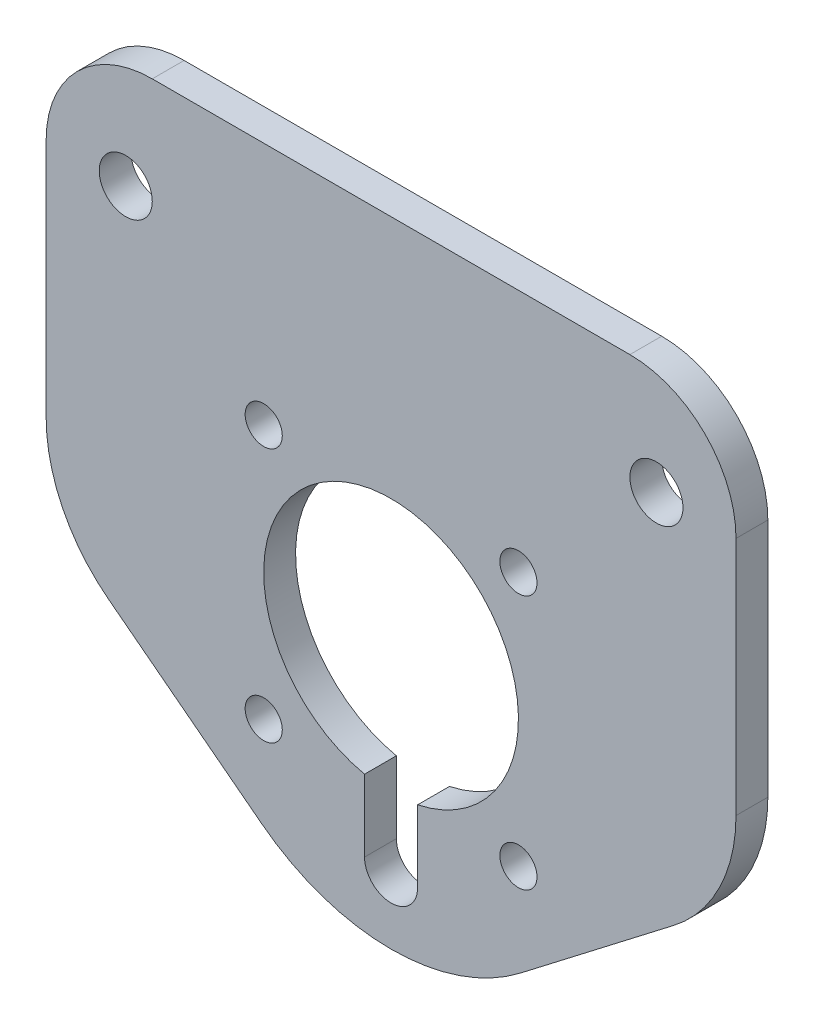
ISO-10303-21;
HEADER;
FILE_DESCRIPTION(('STEP AP214'),'2;1');
FILE_NAME('part.step','',(''),(''),'','','');
FILE_SCHEMA(('AUTOMOTIVE_DESIGN { 1 0 10303 214 1 1 1 1 }'));
ENDSEC;
DATA;
#1=APPLICATION_CONTEXT('core data for automotive mechanical design processes');
#2=APPLICATION_PROTOCOL_DEFINITION('international standard','automotive_design',2000,#1);
#3=PRODUCT_CONTEXT('',#1,'mechanical');
#4=PRODUCT('Part','Part','',(#3));
#5=PRODUCT_RELATED_PRODUCT_CATEGORY('part','',(#4));
#6=PRODUCT_DEFINITION_FORMATION('','',#4);
#7=PRODUCT_DEFINITION_CONTEXT('part definition',#1,'design');
#8=PRODUCT_DEFINITION('design','',#6,#7);
#9=PRODUCT_DEFINITION_SHAPE('','',#8);
#10=(LENGTH_UNIT() NAMED_UNIT(*) SI_UNIT(.MILLI.,.METRE.));
#11=(NAMED_UNIT(*) PLANE_ANGLE_UNIT() SI_UNIT($,.RADIAN.));
#12=(NAMED_UNIT(*) SI_UNIT($,.STERADIAN.) SOLID_ANGLE_UNIT());
#13=UNCERTAINTY_MEASURE_WITH_UNIT(LENGTH_MEASURE(1.E-05),#10,'distance_accuracy_value','');
#14=(GEOMETRIC_REPRESENTATION_CONTEXT(3) GLOBAL_UNCERTAINTY_ASSIGNED_CONTEXT((#13)) GLOBAL_UNIT_ASSIGNED_CONTEXT((#10,
#11,#12)) REPRESENTATION_CONTEXT('',''));
#15=CARTESIAN_POINT('',(0.,0.,0.));
#16=DIRECTION('',(0.,0.,1.));
#17=DIRECTION('',(1.,0.,0.));
#18=AXIS2_PLACEMENT_3D('',#15,#16,#17);
#19=CARTESIAN_POINT('',(0.,0.,3.));
#20=DIRECTION('',(0.,0.,1.));
#21=DIRECTION('',(1.,0.,0.));
#22=AXIS2_PLACEMENT_3D('',#19,#20,#21);
#23=PLANE('',#22);
#24=CARTESIAN_POINT('',(12.,-17.,3.));
#25=DIRECTION('',(0.,0.,1.));
#26=DIRECTION('',(1.,0.,0.));
#27=AXIS2_PLACEMENT_3D('',#24,#25,#26);
#28=CIRCLE('',#27,1.75);
#29=CARTESIAN_POINT('',(13.75,-17.,3.));
#30=VERTEX_POINT('',#29);
#31=EDGE_CURVE('E520',#30,#30,#28,.T.);
#32=ORIENTED_EDGE('',*,*,#31,.F.);
#33=EDGE_LOOP('',(#32));
#34=FACE_BOUND('',#33,.T.);
#35=CARTESIAN_POINT('',(-12.,-17.,3.));
#36=DIRECTION('',(0.,0.,1.));
#37=DIRECTION('',(1.,0.,0.));
#38=AXIS2_PLACEMENT_3D('',#35,#36,#37);
#39=CIRCLE('',#38,1.75);
#40=CARTESIAN_POINT('',(-10.25,-17.,3.));
#41=VERTEX_POINT('',#40);
#42=EDGE_CURVE('E514',#41,#41,#39,.T.);
#43=ORIENTED_EDGE('',*,*,#42,.F.);
#44=EDGE_LOOP('',(#43));
#45=FACE_BOUND('',#44,.T.);
#46=CARTESIAN_POINT('',(0.,-5.,3.));
#47=DIRECTION('',(0.,0.,1.));
#48=DIRECTION('',(1.,0.,0.));
#49=AXIS2_PLACEMENT_3D('',#46,#47,#48);
#50=CIRCLE('',#49,12.);
#51=CARTESIAN_POINT('',(2.49999999999302,-16.736694594307,3.));
#52=VERTEX_POINT('',#51);
#53=CARTESIAN_POINT('',(-2.50000000000698,-16.736694594304,3.));
#54=VERTEX_POINT('',#53);
#55=EDGE_CURVE('E134',#52,#54,#50,.T.);
#56=ORIENTED_EDGE('',*,*,#55,.F.);
#57=DIRECTION('',(0.,1.,0.));
#58=VECTOR('',#57,1.);
#59=CARTESIAN_POINT('',(2.49999999999302,-16.5,3.));
#60=LINE('',#59,#58);
#61=CARTESIAN_POINT('',(2.49999999999302,-23.5,3.));
#62=VERTEX_POINT('',#61);
#63=EDGE_CURVE('E158',#62,#52,#60,.T.);
#64=ORIENTED_EDGE('',*,*,#63,.F.);
#65=CARTESIAN_POINT('',(-6.98116176369495E-12,-23.5,3.));
#66=DIRECTION('',(0.,0.,1.));
#67=DIRECTION('',(1.,0.,0.));
#68=AXIS2_PLACEMENT_3D('',#65,#66,#67);
#69=CIRCLE('',#68,2.5);
#70=CARTESIAN_POINT('',(-2.50000000000698,-23.5,3.));
#71=VERTEX_POINT('',#70);
#72=EDGE_CURVE('E155',#71,#62,#69,.T.);
#73=ORIENTED_EDGE('',*,*,#72,.F.);
#74=DIRECTION('',(0.,-1.,0.));
#75=VECTOR('',#74,1.);
#76=CARTESIAN_POINT('',(-2.50000000000698,-16.5,3.));
#77=LINE('',#76,#75);
#78=EDGE_CURVE('E147',#54,#71,#77,.T.);
#79=ORIENTED_EDGE('',*,*,#78,.F.);
#80=EDGE_LOOP('',(#56,#64,#73,#79));
#81=FACE_BOUND('',#80,.T.);
#82=CARTESIAN_POINT('',(-12.,7.,3.));
#83=DIRECTION('',(0.,0.,1.));
#84=DIRECTION('',(1.,0.,0.));
#85=AXIS2_PLACEMENT_3D('',#82,#83,#84);
#86=CIRCLE('',#85,1.75);
#87=CARTESIAN_POINT('',(-10.25,7.,3.));
#88=VERTEX_POINT('',#87);
#89=EDGE_CURVE('E507',#88,#88,#86,.T.);
#90=ORIENTED_EDGE('',*,*,#89,.F.);
#91=EDGE_LOOP('',(#90));
#92=FACE_BOUND('',#91,.T.);
#93=CARTESIAN_POINT('',(12.,7.,3.));
#94=DIRECTION('',(0.,0.,1.));
#95=DIRECTION('',(1.,0.,0.));
#96=AXIS2_PLACEMENT_3D('',#93,#94,#95);
#97=CIRCLE('',#96,1.75);
#98=CARTESIAN_POINT('',(13.75,7.,3.));
#99=VERTEX_POINT('',#98);
#100=EDGE_CURVE('E519',#99,#99,#97,.T.);
#101=ORIENTED_EDGE('',*,*,#100,.F.);
#102=EDGE_LOOP('',(#101));
#103=FACE_BOUND('',#102,.T.);
#104=CARTESIAN_POINT('',(25.,20.,3.));
#105=DIRECTION('',(0.,0.,1.));
#106=DIRECTION('',(1.,0.,0.));
#107=AXIS2_PLACEMENT_3D('',#104,#105,#106);
#108=CIRCLE('',#107,2.5);
#109=CARTESIAN_POINT('',(27.5,20.,3.));
#110=VERTEX_POINT('',#109);
#111=EDGE_CURVE('E180',#110,#110,#108,.T.);
#112=ORIENTED_EDGE('',*,*,#111,.F.);
#113=EDGE_LOOP('',(#112));
#114=FACE_BOUND('',#113,.T.);
#115=DIRECTION('',(0.792623989104599,-0.609710760849693,0.));
#116=VECTOR('',#115,1.);
#117=CARTESIAN_POINT('',(0.,-35.,3.));
#118=LINE('',#117,#116);
#119=CARTESIAN_POINT('',(-26.6456614127454,-14.5033373748112,3.));
#120=VERTEX_POINT('',#119);
#121=CARTESIAN_POINT('',(-12.1942152169939,-25.6198344484662,3.));
#122=VERTEX_POINT('',#121);
#123=EDGE_CURVE('E195',#120,#122,#118,.T.);
#124=ORIENTED_EDGE('',*,*,#123,.T.);
#125=CARTESIAN_POINT('',(0.,-9.76735466637425,3.));
#126=DIRECTION('',(0.,0.,1.));
#127=DIRECTION('',(1.,0.,0.));
#128=AXIS2_PLACEMENT_3D('',#125,#126,#127);
#129=CIRCLE('',#128,20.);
#130=CARTESIAN_POINT('',(12.1942152169939,-25.6198344484662,3.));
#131=VERTEX_POINT('',#130);
#132=EDGE_CURVE('E241',#122,#131,#129,.T.);
#133=ORIENTED_EDGE('',*,*,#132,.T.);
#134=DIRECTION('',(0.792623989104599,0.609710760849693,0.));
#135=VECTOR('',#134,1.);
#136=CARTESIAN_POINT('',(32.5,-9.99999999999994,3.));
#137=LINE('',#136,#135);
#138=CARTESIAN_POINT('',(26.6456614127454,-14.5033373748112,3.));
#139=VERTEX_POINT('',#138);
#140=EDGE_CURVE('E198',#131,#139,#137,.T.);
#141=ORIENTED_EDGE('',*,*,#140,.T.);
#142=CARTESIAN_POINT('',(17.5,-2.61397753824219,3.));
#143=DIRECTION('',(0.,0.,1.));
#144=DIRECTION('',(1.,0.,0.));
#145=AXIS2_PLACEMENT_3D('',#142,#143,#144);
#146=CIRCLE('',#145,15.);
#147=CARTESIAN_POINT('',(32.5,-2.61397753824219,3.));
#148=VERTEX_POINT('',#147);
#149=EDGE_CURVE('E239',#139,#148,#146,.T.);
#150=ORIENTED_EDGE('',*,*,#149,.T.);
#151=DIRECTION('',(0.,1.,0.));
#152=VECTOR('',#151,1.);
#153=CARTESIAN_POINT('',(32.5,30.,3.));
#154=LINE('',#153,#152);
#155=CARTESIAN_POINT('',(32.5,20.,3.));
#156=VERTEX_POINT('',#155);
#157=EDGE_CURVE('E186',#148,#156,#154,.T.);
#158=ORIENTED_EDGE('',*,*,#157,.T.);
#159=CARTESIAN_POINT('',(22.5,20.,3.));
#160=DIRECTION('',(0.,0.,1.));
#161=DIRECTION('',(1.,0.,0.));
#162=AXIS2_PLACEMENT_3D('',#159,#160,#161);
#163=CIRCLE('',#162,10.);
#164=CARTESIAN_POINT('',(22.5,30.,3.));
#165=VERTEX_POINT('',#164);
#166=EDGE_CURVE('E233',#156,#165,#163,.T.);
#167=ORIENTED_EDGE('',*,*,#166,.T.);
#168=DIRECTION('',(-1.,0.,0.));
#169=VECTOR('',#168,1.);
#170=CARTESIAN_POINT('',(-32.5,30.,3.));
#171=LINE('',#170,#169);
#172=CARTESIAN_POINT('',(-22.5,30.,3.));
#173=VERTEX_POINT('',#172);
#174=EDGE_CURVE('E189',#165,#173,#171,.T.);
#175=ORIENTED_EDGE('',*,*,#174,.T.);
#176=CARTESIAN_POINT('',(-22.5,20.,3.));
#177=DIRECTION('',(0.,0.,1.));
#178=DIRECTION('',(1.,0.,0.));
#179=AXIS2_PLACEMENT_3D('',#176,#177,#178);
#180=CIRCLE('',#179,10.);
#181=CARTESIAN_POINT('',(-32.5,20.,3.));
#182=VERTEX_POINT('',#181);
#183=EDGE_CURVE('E235',#173,#182,#180,.T.);
#184=ORIENTED_EDGE('',*,*,#183,.T.);
#185=DIRECTION('',(0.,-1.,0.));
#186=VECTOR('',#185,1.);
#187=CARTESIAN_POINT('',(-32.5,-9.99999999999994,3.));
#188=LINE('',#187,#186);
#189=CARTESIAN_POINT('',(-32.5,-2.61397753824219,3.));
#190=VERTEX_POINT('',#189);
#191=EDGE_CURVE('E193',#182,#190,#188,.T.);
#192=ORIENTED_EDGE('',*,*,#191,.T.);
#193=CARTESIAN_POINT('',(-17.5,-2.61397753824219,3.));
#194=DIRECTION('',(0.,0.,1.));
#195=DIRECTION('',(1.,0.,0.));
#196=AXIS2_PLACEMENT_3D('',#193,#194,#195);
#197=CIRCLE('',#196,15.);
#198=EDGE_CURVE('E237',#190,#120,#197,.T.);
#199=ORIENTED_EDGE('',*,*,#198,.T.);
#200=EDGE_LOOP('',(#124,#133,#141,#150,#158,#167,#175,#184,#192,#199));
#201=FACE_BOUND('',#200,.T.);
#202=CARTESIAN_POINT('',(-25.,20.,3.));
#203=DIRECTION('',(0.,0.,1.));
#204=DIRECTION('',(1.,0.,0.));
#205=AXIS2_PLACEMENT_3D('',#202,#203,#204);
#206=CIRCLE('',#205,2.5);
#207=CARTESIAN_POINT('',(-22.5,20.,3.));
#208=VERTEX_POINT('',#207);
#209=EDGE_CURVE('E174',#208,#208,#206,.T.);
#210=ORIENTED_EDGE('',*,*,#209,.F.);
#211=EDGE_LOOP('',(#210));
#212=FACE_BOUND('',#211,.T.);
#213=ADVANCED_FACE('F34',(#34,#45,#81,#92,#103,#114,#201,#212),#23,.T.);
#214=CARTESIAN_POINT('',(0.,0.,0.));
#215=DIRECTION('',(0.,0.,1.));
#216=DIRECTION('',(1.,0.,0.));
#217=AXIS2_PLACEMENT_3D('',#214,#215,#216);
#218=PLANE('',#217);
#219=CARTESIAN_POINT('',(12.,-17.,0.));
#220=DIRECTION('',(0.,0.,1.));
#221=DIRECTION('',(1.,0.,0.));
#222=AXIS2_PLACEMENT_3D('',#219,#220,#221);
#223=CIRCLE('',#222,1.75);
#224=CARTESIAN_POINT('',(13.75,-17.,0.));
#225=VERTEX_POINT('',#224);
#226=EDGE_CURVE('E516',#225,#225,#223,.T.);
#227=ORIENTED_EDGE('',*,*,#226,.T.);
#228=EDGE_LOOP('',(#227));
#229=FACE_BOUND('',#228,.T.);
#230=CARTESIAN_POINT('',(-12.,-17.,0.));
#231=DIRECTION('',(0.,0.,1.));
#232=DIRECTION('',(1.,0.,0.));
#233=AXIS2_PLACEMENT_3D('',#230,#231,#232);
#234=CIRCLE('',#233,1.75);
#235=CARTESIAN_POINT('',(-10.25,-17.,0.));
#236=VERTEX_POINT('',#235);
#237=EDGE_CURVE('E523',#236,#236,#234,.T.);
#238=ORIENTED_EDGE('',*,*,#237,.T.);
#239=EDGE_LOOP('',(#238));
#240=FACE_BOUND('',#239,.T.);
#241=CARTESIAN_POINT('',(-12.,7.,0.));
#242=DIRECTION('',(0.,0.,1.));
#243=DIRECTION('',(1.,0.,0.));
#244=AXIS2_PLACEMENT_3D('',#241,#242,#243);
#245=CIRCLE('',#244,1.75);
#246=CARTESIAN_POINT('',(-10.25,7.,0.));
#247=VERTEX_POINT('',#246);
#248=EDGE_CURVE('E510',#247,#247,#245,.T.);
#249=ORIENTED_EDGE('',*,*,#248,.T.);
#250=EDGE_LOOP('',(#249));
#251=FACE_BOUND('',#250,.T.);
#252=CARTESIAN_POINT('',(12.,7.,0.));
#253=DIRECTION('',(0.,0.,1.));
#254=DIRECTION('',(1.,0.,0.));
#255=AXIS2_PLACEMENT_3D('',#252,#253,#254);
#256=CIRCLE('',#255,1.75);
#257=CARTESIAN_POINT('',(13.75,7.,0.));
#258=VERTEX_POINT('',#257);
#259=EDGE_CURVE('E150',#258,#258,#256,.T.);
#260=ORIENTED_EDGE('',*,*,#259,.T.);
#261=EDGE_LOOP('',(#260));
#262=FACE_BOUND('',#261,.T.);
#263=CARTESIAN_POINT('',(-25.,20.,0.));
#264=DIRECTION('',(0.,0.,1.));
#265=DIRECTION('',(1.,0.,0.));
#266=AXIS2_PLACEMENT_3D('',#263,#264,#265);
#267=CIRCLE('',#266,2.5);
#268=CARTESIAN_POINT('',(-22.5,20.,0.));
#269=VERTEX_POINT('',#268);
#270=EDGE_CURVE('E173',#269,#269,#267,.T.);
#271=ORIENTED_EDGE('',*,*,#270,.T.);
#272=EDGE_LOOP('',(#271));
#273=FACE_BOUND('',#272,.T.);
#274=CARTESIAN_POINT('',(25.,20.,0.));
#275=DIRECTION('',(0.,0.,1.));
#276=DIRECTION('',(1.,0.,0.));
#277=AXIS2_PLACEMENT_3D('',#274,#275,#276);
#278=CIRCLE('',#277,2.5);
#279=CARTESIAN_POINT('',(27.5,20.,0.));
#280=VERTEX_POINT('',#279);
#281=EDGE_CURVE('E177',#280,#280,#278,.T.);
#282=ORIENTED_EDGE('',*,*,#281,.T.);
#283=EDGE_LOOP('',(#282));
#284=FACE_BOUND('',#283,.T.);
#285=DIRECTION('',(0.792623989104599,0.609710760849693,0.));
#286=VECTOR('',#285,1.);
#287=CARTESIAN_POINT('',(32.5,-9.99999999999994,0.));
#288=LINE('',#287,#286);
#289=CARTESIAN_POINT('',(12.1942152169939,-25.6198344484662,0.));
#290=VERTEX_POINT('',#289);
#291=CARTESIAN_POINT('',(26.6456614127454,-14.5033373748112,0.));
#292=VERTEX_POINT('',#291);
#293=EDGE_CURVE('E190',#290,#292,#288,.T.);
#294=ORIENTED_EDGE('',*,*,#293,.F.);
#295=CARTESIAN_POINT('',(0.,-9.76735466637425,0.));
#296=DIRECTION('',(0.,0.,1.));
#297=DIRECTION('',(1.,0.,0.));
#298=AXIS2_PLACEMENT_3D('',#295,#296,#297);
#299=CIRCLE('',#298,20.);
#300=CARTESIAN_POINT('',(-12.1942152169939,-25.6198344484662,0.));
#301=VERTEX_POINT('',#300);
#302=EDGE_CURVE('E226',#290,#301,#299,.F.);
#303=ORIENTED_EDGE('',*,*,#302,.T.);
#304=DIRECTION('',(0.792623989104599,-0.609710760849693,0.));
#305=VECTOR('',#304,1.);
#306=CARTESIAN_POINT('',(0.,-35.,0.));
#307=LINE('',#306,#305);
#308=CARTESIAN_POINT('',(-26.6456614127454,-14.5033373748112,0.));
#309=VERTEX_POINT('',#308);
#310=EDGE_CURVE('E209',#309,#301,#307,.T.);
#311=ORIENTED_EDGE('',*,*,#310,.F.);
#312=CARTESIAN_POINT('',(-17.5,-2.61397753824219,0.));
#313=DIRECTION('',(0.,0.,1.));
#314=DIRECTION('',(1.,0.,0.));
#315=AXIS2_PLACEMENT_3D('',#312,#313,#314);
#316=CIRCLE('',#315,15.);
#317=CARTESIAN_POINT('',(-32.5,-2.61397753824219,0.));
#318=VERTEX_POINT('',#317);
#319=EDGE_CURVE('E222',#309,#318,#316,.F.);
#320=ORIENTED_EDGE('',*,*,#319,.T.);
#321=DIRECTION('',(0.,-1.,0.));
#322=VECTOR('',#321,1.);
#323=CARTESIAN_POINT('',(-32.5,-9.99999999999994,0.));
#324=LINE('',#323,#322);
#325=CARTESIAN_POINT('',(-32.5,20.,0.));
#326=VERTEX_POINT('',#325);
#327=EDGE_CURVE('E207',#326,#318,#324,.T.);
#328=ORIENTED_EDGE('',*,*,#327,.F.);
#329=CARTESIAN_POINT('',(-22.5,20.,0.));
#330=DIRECTION('',(0.,0.,1.));
#331=DIRECTION('',(1.,0.,0.));
#332=AXIS2_PLACEMENT_3D('',#329,#330,#331);
#333=CIRCLE('',#332,10.);
#334=CARTESIAN_POINT('',(-22.5,30.,0.));
#335=VERTEX_POINT('',#334);
#336=EDGE_CURVE('E220',#326,#335,#333,.F.);
#337=ORIENTED_EDGE('',*,*,#336,.T.);
#338=DIRECTION('',(-1.,0.,0.));
#339=VECTOR('',#338,1.);
#340=CARTESIAN_POINT('',(-32.5,30.,0.));
#341=LINE('',#340,#339);
#342=CARTESIAN_POINT('',(22.5,30.,0.));
#343=VERTEX_POINT('',#342);
#344=EDGE_CURVE('E204',#343,#335,#341,.T.);
#345=ORIENTED_EDGE('',*,*,#344,.F.);
#346=CARTESIAN_POINT('',(22.5,20.,0.));
#347=DIRECTION('',(0.,0.,1.));
#348=DIRECTION('',(1.,0.,0.));
#349=AXIS2_PLACEMENT_3D('',#346,#347,#348);
#350=CIRCLE('',#349,10.);
#351=CARTESIAN_POINT('',(32.5,20.,0.));
#352=VERTEX_POINT('',#351);
#353=EDGE_CURVE('E218',#343,#352,#350,.F.);
#354=ORIENTED_EDGE('',*,*,#353,.T.);
#355=DIRECTION('',(0.,1.,0.));
#356=VECTOR('',#355,1.);
#357=CARTESIAN_POINT('',(32.5,30.,0.));
#358=LINE('',#357,#356);
#359=CARTESIAN_POINT('',(32.5,-2.61397753824219,0.));
#360=VERTEX_POINT('',#359);
#361=EDGE_CURVE('E183',#360,#352,#358,.T.);
#362=ORIENTED_EDGE('',*,*,#361,.F.);
#363=CARTESIAN_POINT('',(17.5,-2.61397753824219,0.));
#364=DIRECTION('',(0.,0.,1.));
#365=DIRECTION('',(1.,0.,0.));
#366=AXIS2_PLACEMENT_3D('',#363,#364,#365);
#367=CIRCLE('',#366,15.);
#368=EDGE_CURVE('E224',#360,#292,#367,.F.);
#369=ORIENTED_EDGE('',*,*,#368,.T.);
#370=EDGE_LOOP('',(#294,#303,#311,#320,#328,#337,#345,#354,#362,#369));
#371=FACE_BOUND('',#370,.T.);
#372=DIRECTION('',(0.,1.,0.));
#373=VECTOR('',#372,1.);
#374=CARTESIAN_POINT('',(2.49999999999302,-16.5,0.));
#375=LINE('',#374,#373);
#376=CARTESIAN_POINT('',(2.49999999999302,-23.5,0.));
#377=VERTEX_POINT('',#376);
#378=CARTESIAN_POINT('',(2.49999999999302,-16.736694594307,0.));
#379=VERTEX_POINT('',#378);
#380=EDGE_CURVE('E156',#377,#379,#375,.T.);
#381=ORIENTED_EDGE('',*,*,#380,.T.);
#382=CARTESIAN_POINT('',(0.,-5.,0.));
#383=DIRECTION('',(0.,0.,1.));
#384=DIRECTION('',(1.,0.,0.));
#385=AXIS2_PLACEMENT_3D('',#382,#383,#384);
#386=CIRCLE('',#385,12.);
#387=CARTESIAN_POINT('',(-2.50000000000698,-16.736694594304,0.));
#388=VERTEX_POINT('',#387);
#389=EDGE_CURVE('E48',#379,#388,#386,.T.);
#390=ORIENTED_EDGE('',*,*,#389,.T.);
#391=DIRECTION('',(0.,-1.,0.));
#392=VECTOR('',#391,1.);
#393=CARTESIAN_POINT('',(-2.50000000000698,-16.5,0.));
#394=LINE('',#393,#392);
#395=CARTESIAN_POINT('',(-2.50000000000698,-23.5,0.));
#396=VERTEX_POINT('',#395);
#397=EDGE_CURVE('E149',#388,#396,#394,.T.);
#398=ORIENTED_EDGE('',*,*,#397,.T.);
#399=CARTESIAN_POINT('',(-6.98116176369495E-12,-23.5,0.));
#400=DIRECTION('',(0.,0.,1.));
#401=DIRECTION('',(1.,0.,0.));
#402=AXIS2_PLACEMENT_3D('',#399,#400,#401);
#403=CIRCLE('',#402,2.5);
#404=EDGE_CURVE('E161',#396,#377,#403,.T.);
#405=ORIENTED_EDGE('',*,*,#404,.T.);
#406=EDGE_LOOP('',(#381,#390,#398,#405));
#407=FACE_BOUND('',#406,.T.);
#408=ADVANCED_FACE('F271',(#229,#240,#251,#262,#273,#284,#371,#407),#218,.F.);
#409=CARTESIAN_POINT('',(32.5,30.,3.));
#410=DIRECTION('',(-1.,0.,0.));
#411=DIRECTION('',(0.,0.,1.));
#412=AXIS2_PLACEMENT_3D('',#409,#410,#411);
#413=PLANE('',#412);
#414=ORIENTED_EDGE('',*,*,#157,.F.);
#415=DIRECTION('',(0.,0.,-1.));
#416=VECTOR('',#415,1.);
#417=CARTESIAN_POINT('',(32.5,-2.61397753824219,3.));
#418=LINE('',#417,#416);
#419=EDGE_CURVE('E245',#148,#360,#418,.T.);
#420=ORIENTED_EDGE('',*,*,#419,.T.);
#421=ORIENTED_EDGE('',*,*,#361,.T.);
#422=DIRECTION('',(0.,0.,-1.));
#423=VECTOR('',#422,1.);
#424=CARTESIAN_POINT('',(32.5,20.,3.));
#425=LINE('',#424,#423);
#426=EDGE_CURVE('E243',#352,#156,#425,.F.);
#427=ORIENTED_EDGE('',*,*,#426,.T.);
#428=EDGE_LOOP('',(#414,#420,#421,#427));
#429=FACE_BOUND('',#428,.T.);
#430=ADVANCED_FACE('F297',(#429),#413,.F.);
#431=CARTESIAN_POINT('',(-32.5,30.,3.));
#432=DIRECTION('',(0.,-1.,0.));
#433=DIRECTION('',(0.,0.,-1.));
#434=AXIS2_PLACEMENT_3D('',#431,#432,#433);
#435=PLANE('',#434);
#436=ORIENTED_EDGE('',*,*,#344,.T.);
#437=DIRECTION('',(0.,0.,-1.));
#438=VECTOR('',#437,1.);
#439=CARTESIAN_POINT('',(-22.5,30.,3.));
#440=LINE('',#439,#438);
#441=EDGE_CURVE('E42',#335,#173,#440,.F.);
#442=ORIENTED_EDGE('',*,*,#441,.T.);
#443=ORIENTED_EDGE('',*,*,#174,.F.);
#444=DIRECTION('',(0.,0.,-1.));
#445=VECTOR('',#444,1.);
#446=CARTESIAN_POINT('',(22.5,30.,3.));
#447=LINE('',#446,#445);
#448=EDGE_CURVE('E252',#165,#343,#447,.T.);
#449=ORIENTED_EDGE('',*,*,#448,.T.);
#450=EDGE_LOOP('',(#436,#442,#443,#449));
#451=FACE_BOUND('',#450,.T.);
#452=ADVANCED_FACE('F257',(#451),#435,.F.);
#453=CARTESIAN_POINT('',(-32.5,-9.99999999999994,3.));
#454=DIRECTION('',(1.,0.,0.));
#455=DIRECTION('',(0.,0.,-1.));
#456=AXIS2_PLACEMENT_3D('',#453,#454,#455);
#457=PLANE('',#456);
#458=ORIENTED_EDGE('',*,*,#327,.T.);
#459=DIRECTION('',(0.,0.,-1.));
#460=VECTOR('',#459,1.);
#461=CARTESIAN_POINT('',(-32.5,-2.61397753824219,3.));
#462=LINE('',#461,#460);
#463=EDGE_CURVE('E56',#318,#190,#462,.F.);
#464=ORIENTED_EDGE('',*,*,#463,.T.);
#465=ORIENTED_EDGE('',*,*,#191,.F.);
#466=DIRECTION('',(0.,0.,-1.));
#467=VECTOR('',#466,1.);
#468=CARTESIAN_POINT('',(-32.5,20.,3.));
#469=LINE('',#468,#467);
#470=EDGE_CURVE('E248',#182,#326,#469,.T.);
#471=ORIENTED_EDGE('',*,*,#470,.T.);
#472=EDGE_LOOP('',(#458,#464,#465,#471));
#473=FACE_BOUND('',#472,.T.);
#474=ADVANCED_FACE('F268',(#473),#457,.F.);
#475=CARTESIAN_POINT('',(0.,-35.,3.));
#476=DIRECTION('',(0.609710760849693,0.792623989104599,0.));
#477=DIRECTION('',(-0.792623989104599,0.609710760849693,0.));
#478=AXIS2_PLACEMENT_3D('',#475,#476,#477);
#479=PLANE('',#478);
#480=ORIENTED_EDGE('',*,*,#310,.T.);
#481=DIRECTION('',(0.,0.,-1.));
#482=VECTOR('',#481,1.);
#483=CARTESIAN_POINT('',(-12.1942152169939,-25.6198344484662,3.));
#484=LINE('',#483,#482);
#485=EDGE_CURVE('E231',#301,#122,#484,.F.);
#486=ORIENTED_EDGE('',*,*,#485,.T.);
#487=ORIENTED_EDGE('',*,*,#123,.F.);
#488=DIRECTION('',(0.,0.,-1.));
#489=VECTOR('',#488,1.);
#490=CARTESIAN_POINT('',(-26.6456614127454,-14.5033373748112,3.));
#491=LINE('',#490,#489);
#492=EDGE_CURVE('E228',#120,#309,#491,.T.);
#493=ORIENTED_EDGE('',*,*,#492,.T.);
#494=EDGE_LOOP('',(#480,#486,#487,#493));
#495=FACE_BOUND('',#494,.T.);
#496=ADVANCED_FACE('F280',(#495),#479,.F.);
#497=CARTESIAN_POINT('',(32.5,-9.99999999999994,3.));
#498=DIRECTION('',(-0.609710760849693,0.792623989104599,0.));
#499=DIRECTION('',(-0.792623989104599,-0.609710760849693,0.));
#500=AXIS2_PLACEMENT_3D('',#497,#498,#499);
#501=PLANE('',#500);
#502=ORIENTED_EDGE('',*,*,#140,.F.);
#503=DIRECTION('',(0.,0.,-1.));
#504=VECTOR('',#503,1.);
#505=CARTESIAN_POINT('',(12.1942152169939,-25.6198344484662,3.));
#506=LINE('',#505,#504);
#507=EDGE_CURVE('E215',#131,#290,#506,.T.);
#508=ORIENTED_EDGE('',*,*,#507,.T.);
#509=ORIENTED_EDGE('',*,*,#293,.T.);
#510=DIRECTION('',(0.,0.,-1.));
#511=VECTOR('',#510,1.);
#512=CARTESIAN_POINT('',(26.6456614127454,-14.5033373748112,3.));
#513=LINE('',#512,#511);
#514=EDGE_CURVE('E201',#292,#139,#513,.F.);
#515=ORIENTED_EDGE('',*,*,#514,.T.);
#516=EDGE_LOOP('',(#502,#508,#509,#515));
#517=FACE_BOUND('',#516,.T.);
#518=ADVANCED_FACE('F288',(#517),#501,.F.);
#519=CARTESIAN_POINT('',(25.,20.,3.));
#520=DIRECTION('',(0.,0.,-1.));
#521=DIRECTION('',(-1.,0.,0.));
#522=AXIS2_PLACEMENT_3D('',#519,#520,#521);
#523=CYLINDRICAL_SURFACE('',#522,2.5);
#524=ORIENTED_EDGE('',*,*,#111,.T.);
#525=EDGE_LOOP('',(#524));
#526=FACE_BOUND('',#525,.T.);
#527=ORIENTED_EDGE('',*,*,#281,.F.);
#528=EDGE_LOOP('',(#527));
#529=FACE_BOUND('',#528,.T.);
#530=ADVANCED_FACE('F318',(#526,#529),#523,.F.);
#531=CARTESIAN_POINT('',(-25.,20.,3.));
#532=DIRECTION('',(0.,0.,-1.));
#533=DIRECTION('',(-1.,0.,0.));
#534=AXIS2_PLACEMENT_3D('',#531,#532,#533);
#535=CYLINDRICAL_SURFACE('',#534,2.5);
#536=ORIENTED_EDGE('',*,*,#209,.T.);
#537=EDGE_LOOP('',(#536));
#538=FACE_BOUND('',#537,.T.);
#539=ORIENTED_EDGE('',*,*,#270,.F.);
#540=EDGE_LOOP('',(#539));
#541=FACE_BOUND('',#540,.T.);
#542=ADVANCED_FACE('F371',(#538,#541),#535,.F.);
#543=CARTESIAN_POINT('',(-2.50000000000698,-16.5,3.));
#544=DIRECTION('',(1.,0.,0.));
#545=DIRECTION('',(0.,1.,0.));
#546=AXIS2_PLACEMENT_3D('',#543,#544,#545);
#547=PLANE('',#546);
#548=DIRECTION('',(0.,0.,1.));
#549=VECTOR('',#548,1.);
#550=CARTESIAN_POINT('',(-2.50000000000698,-16.736694594304,0.));
#551=LINE('',#550,#549);
#552=EDGE_CURVE('E137',#54,#388,#551,.F.);
#553=ORIENTED_EDGE('',*,*,#552,.F.);
#554=ORIENTED_EDGE('',*,*,#78,.T.);
#555=DIRECTION('',(0.,0.,-1.));
#556=VECTOR('',#555,1.);
#557=CARTESIAN_POINT('',(-2.50000000000698,-23.5,3.));
#558=LINE('',#557,#556);
#559=EDGE_CURVE('E171',#71,#396,#558,.T.);
#560=ORIENTED_EDGE('',*,*,#559,.T.);
#561=ORIENTED_EDGE('',*,*,#397,.F.);
#562=EDGE_LOOP('',(#553,#554,#560,#561));
#563=FACE_BOUND('',#562,.T.);
#564=ADVANCED_FACE('F145',(#563),#547,.T.);
#565=CARTESIAN_POINT('',(-6.98116176369495E-12,-23.5,3.));
#566=DIRECTION('',(0.,0.,-1.));
#567=DIRECTION('',(-1.,0.,0.));
#568=AXIS2_PLACEMENT_3D('',#565,#566,#567);
#569=CYLINDRICAL_SURFACE('',#568,2.5);
#570=ORIENTED_EDGE('',*,*,#404,.F.);
#571=ORIENTED_EDGE('',*,*,#559,.F.);
#572=ORIENTED_EDGE('',*,*,#72,.T.);
#573=DIRECTION('',(0.,0.,-1.));
#574=VECTOR('',#573,1.);
#575=CARTESIAN_POINT('',(2.49999999999302,-23.5,3.));
#576=LINE('',#575,#574);
#577=EDGE_CURVE('E166',#62,#377,#576,.T.);
#578=ORIENTED_EDGE('',*,*,#577,.T.);
#579=EDGE_LOOP('',(#570,#571,#572,#578));
#580=FACE_BOUND('',#579,.T.);
#581=ADVANCED_FACE('F370',(#580),#569,.F.);
#582=CARTESIAN_POINT('',(2.49999999999302,-16.5,3.));
#583=DIRECTION('',(-1.,0.,0.));
#584=DIRECTION('',(0.,-1.,0.));
#585=AXIS2_PLACEMENT_3D('',#582,#583,#584);
#586=PLANE('',#585);
#587=DIRECTION('',(0.,0.,1.));
#588=VECTOR('',#587,1.);
#589=CARTESIAN_POINT('',(2.49999999999302,-16.736694594307,0.));
#590=LINE('',#589,#588);
#591=EDGE_CURVE('E12',#379,#52,#590,.T.);
#592=ORIENTED_EDGE('',*,*,#591,.F.);
#593=ORIENTED_EDGE('',*,*,#380,.F.);
#594=ORIENTED_EDGE('',*,*,#577,.F.);
#595=ORIENTED_EDGE('',*,*,#63,.T.);
#596=EDGE_LOOP('',(#592,#593,#594,#595));
#597=FACE_BOUND('',#596,.T.);
#598=ADVANCED_FACE('F333',(#597),#586,.T.);
#599=CARTESIAN_POINT('',(0.,-9.76735466637425,3.));
#600=DIRECTION('',(0.,0.,-1.));
#601=DIRECTION('',(-1.,0.,0.));
#602=AXIS2_PLACEMENT_3D('',#599,#600,#601);
#603=CYLINDRICAL_SURFACE('',#602,20.);
#604=ORIENTED_EDGE('',*,*,#132,.F.);
#605=ORIENTED_EDGE('',*,*,#485,.F.);
#606=ORIENTED_EDGE('',*,*,#302,.F.);
#607=ORIENTED_EDGE('',*,*,#507,.F.);
#608=EDGE_LOOP('',(#604,#605,#606,#607));
#609=FACE_BOUND('',#608,.T.);
#610=ADVANCED_FACE('F286',(#609),#603,.T.);
#611=CARTESIAN_POINT('',(17.5,-2.61397753824219,3.));
#612=DIRECTION('',(0.,0.,-1.));
#613=DIRECTION('',(-1.,0.,0.));
#614=AXIS2_PLACEMENT_3D('',#611,#612,#613);
#615=CYLINDRICAL_SURFACE('',#614,15.);
#616=ORIENTED_EDGE('',*,*,#149,.F.);
#617=ORIENTED_EDGE('',*,*,#514,.F.);
#618=ORIENTED_EDGE('',*,*,#368,.F.);
#619=ORIENTED_EDGE('',*,*,#419,.F.);
#620=EDGE_LOOP('',(#616,#617,#618,#619));
#621=FACE_BOUND('',#620,.T.);
#622=ADVANCED_FACE('F294',(#621),#615,.T.);
#623=CARTESIAN_POINT('',(-17.5,-2.61397753824219,3.));
#624=DIRECTION('',(0.,0.,-1.));
#625=DIRECTION('',(-1.,0.,0.));
#626=AXIS2_PLACEMENT_3D('',#623,#624,#625);
#627=CYLINDRICAL_SURFACE('',#626,15.);
#628=ORIENTED_EDGE('',*,*,#198,.F.);
#629=ORIENTED_EDGE('',*,*,#463,.F.);
#630=ORIENTED_EDGE('',*,*,#319,.F.);
#631=ORIENTED_EDGE('',*,*,#492,.F.);
#632=EDGE_LOOP('',(#628,#629,#630,#631));
#633=FACE_BOUND('',#632,.T.);
#634=ADVANCED_FACE('F277',(#633),#627,.T.);
#635=CARTESIAN_POINT('',(-22.5,20.,3.));
#636=DIRECTION('',(0.,0.,-1.));
#637=DIRECTION('',(-1.,0.,0.));
#638=AXIS2_PLACEMENT_3D('',#635,#636,#637);
#639=CYLINDRICAL_SURFACE('',#638,10.);
#640=ORIENTED_EDGE('',*,*,#183,.F.);
#641=ORIENTED_EDGE('',*,*,#441,.F.);
#642=ORIENTED_EDGE('',*,*,#336,.F.);
#643=ORIENTED_EDGE('',*,*,#470,.F.);
#644=EDGE_LOOP('',(#640,#641,#642,#643));
#645=FACE_BOUND('',#644,.T.);
#646=ADVANCED_FACE('F266',(#645),#639,.T.);
#647=CARTESIAN_POINT('',(22.5,20.,3.));
#648=DIRECTION('',(0.,0.,-1.));
#649=DIRECTION('',(-1.,0.,0.));
#650=AXIS2_PLACEMENT_3D('',#647,#648,#649);
#651=CYLINDRICAL_SURFACE('',#650,10.);
#652=ORIENTED_EDGE('',*,*,#166,.F.);
#653=ORIENTED_EDGE('',*,*,#426,.F.);
#654=ORIENTED_EDGE('',*,*,#353,.F.);
#655=ORIENTED_EDGE('',*,*,#448,.F.);
#656=EDGE_LOOP('',(#652,#653,#654,#655));
#657=FACE_BOUND('',#656,.T.);
#658=ADVANCED_FACE('F36',(#657),#651,.T.);
#659=CARTESIAN_POINT('',(0.,-5.,0.));
#660=DIRECTION('',(0.,0.,1.));
#661=DIRECTION('',(1.,0.,0.));
#662=AXIS2_PLACEMENT_3D('',#659,#660,#661);
#663=CYLINDRICAL_SURFACE('',#662,12.);
#664=ORIENTED_EDGE('',*,*,#552,.T.);
#665=ORIENTED_EDGE('',*,*,#389,.F.);
#666=ORIENTED_EDGE('',*,*,#591,.T.);
#667=ORIENTED_EDGE('',*,*,#55,.T.);
#668=EDGE_LOOP('',(#664,#665,#666,#667));
#669=FACE_BOUND('',#668,.T.);
#670=ADVANCED_FACE('F136',(#669),#663,.F.);
#671=CARTESIAN_POINT('',(12.,7.,0.));
#672=DIRECTION('',(0.,0.,1.));
#673=DIRECTION('',(1.,0.,0.));
#674=AXIS2_PLACEMENT_3D('',#671,#672,#673);
#675=CYLINDRICAL_SURFACE('',#674,1.75);
#676=ORIENTED_EDGE('',*,*,#259,.F.);
#677=EDGE_LOOP('',(#676));
#678=FACE_BOUND('',#677,.T.);
#679=ORIENTED_EDGE('',*,*,#100,.T.);
#680=EDGE_LOOP('',(#679));
#681=FACE_BOUND('',#680,.T.);
#682=ADVANCED_FACE('F305',(#678,#681),#675,.F.);
#683=CARTESIAN_POINT('',(-12.,7.,0.));
#684=DIRECTION('',(0.,0.,1.));
#685=DIRECTION('',(1.,0.,0.));
#686=AXIS2_PLACEMENT_3D('',#683,#684,#685);
#687=CYLINDRICAL_SURFACE('',#686,1.75);
#688=ORIENTED_EDGE('',*,*,#248,.F.);
#689=EDGE_LOOP('',(#688));
#690=FACE_BOUND('',#689,.T.);
#691=ORIENTED_EDGE('',*,*,#89,.T.);
#692=EDGE_LOOP('',(#691));
#693=FACE_BOUND('',#692,.T.);
#694=ADVANCED_FACE('F399',(#690,#693),#687,.F.);
#695=CARTESIAN_POINT('',(-12.,-17.,0.));
#696=DIRECTION('',(0.,0.,1.));
#697=DIRECTION('',(1.,0.,0.));
#698=AXIS2_PLACEMENT_3D('',#695,#696,#697);
#699=CYLINDRICAL_SURFACE('',#698,1.75);
#700=ORIENTED_EDGE('',*,*,#237,.F.);
#701=EDGE_LOOP('',(#700));
#702=FACE_BOUND('',#701,.T.);
#703=ORIENTED_EDGE('',*,*,#42,.T.);
#704=EDGE_LOOP('',(#703));
#705=FACE_BOUND('',#704,.T.);
#706=ADVANCED_FACE('F409',(#702,#705),#699,.F.);
#707=CARTESIAN_POINT('',(12.,-17.,0.));
#708=DIRECTION('',(0.,0.,1.));
#709=DIRECTION('',(1.,0.,0.));
#710=AXIS2_PLACEMENT_3D('',#707,#708,#709);
#711=CYLINDRICAL_SURFACE('',#710,1.75);
#712=ORIENTED_EDGE('',*,*,#226,.F.);
#713=EDGE_LOOP('',(#712));
#714=FACE_BOUND('',#713,.T.);
#715=ORIENTED_EDGE('',*,*,#31,.T.);
#716=EDGE_LOOP('',(#715));
#717=FACE_BOUND('',#716,.T.);
#718=ADVANCED_FACE('F419',(#714,#717),#711,.F.);
#719=CLOSED_SHELL('',(#213,#408,#430,#452,#474,#496,#518,#530,#542,#564,#581,#598,#610,#622,
#634,#646,#658,#670,#682,#694,#706,#718));
#720=MANIFOLD_SOLID_BREP('B2',#719);
#721=ADVANCED_BREP_SHAPE_REPRESENTATION('',(#18,#720),#14);
#722=SHAPE_DEFINITION_REPRESENTATION(#9,#721);
ENDSEC;
END-ISO-10303-21;
